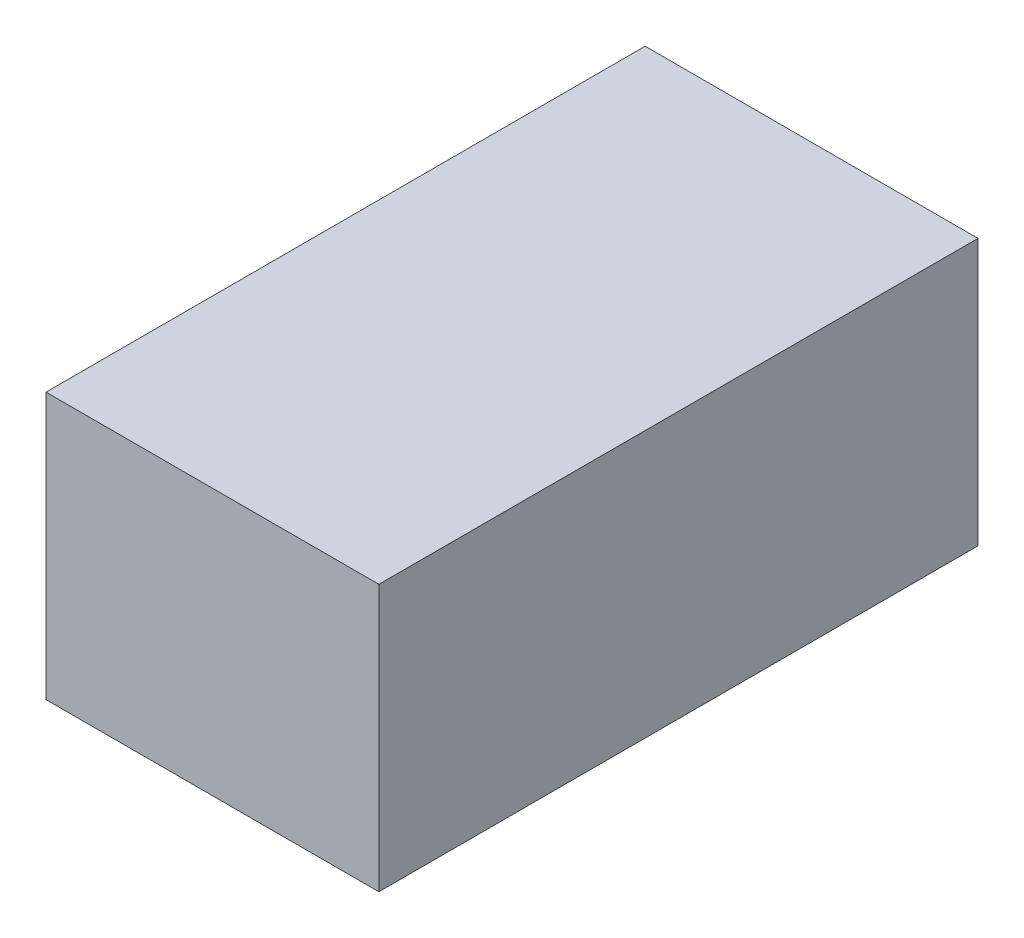
ISO-10303-21;
HEADER;
FILE_DESCRIPTION(('STEP AP214'),'2;1');
FILE_NAME('part.step','',(''),(''),'','','');
FILE_SCHEMA(('AUTOMOTIVE_DESIGN { 1 0 10303 214 1 1 1 1 }'));
ENDSEC;
DATA;
#1=APPLICATION_CONTEXT('core data for automotive mechanical design processes');
#2=APPLICATION_PROTOCOL_DEFINITION('international standard','automotive_design',2000,#1);
#3=PRODUCT_CONTEXT('',#1,'mechanical');
#4=PRODUCT('Part','Part','',(#3));
#5=PRODUCT_RELATED_PRODUCT_CATEGORY('part','',(#4));
#6=PRODUCT_DEFINITION_FORMATION('','',#4);
#7=PRODUCT_DEFINITION_CONTEXT('part definition',#1,'design');
#8=PRODUCT_DEFINITION('design','',#6,#7);
#9=PRODUCT_DEFINITION_SHAPE('','',#8);
#10=(LENGTH_UNIT() NAMED_UNIT(*) SI_UNIT(.MILLI.,.METRE.));
#11=(NAMED_UNIT(*) PLANE_ANGLE_UNIT() SI_UNIT($,.RADIAN.));
#12=(NAMED_UNIT(*) SI_UNIT($,.STERADIAN.) SOLID_ANGLE_UNIT());
#13=UNCERTAINTY_MEASURE_WITH_UNIT(LENGTH_MEASURE(1.E-05),#10,'distance_accuracy_value','');
#14=(GEOMETRIC_REPRESENTATION_CONTEXT(3) GLOBAL_UNCERTAINTY_ASSIGNED_CONTEXT((#13)) GLOBAL_UNIT_ASSIGNED_CONTEXT((#10,
#11,#12)) REPRESENTATION_CONTEXT('',''));
#15=CARTESIAN_POINT('',(0.,0.,0.));
#16=DIRECTION('',(0.,0.,1.));
#17=DIRECTION('',(1.,0.,0.));
#18=AXIS2_PLACEMENT_3D('',#15,#16,#17);
#19=CARTESIAN_POINT('',(0.,0.,54.));
#20=DIRECTION('',(1.,0.,0.));
#21=DIRECTION('',(0.,0.,-1.));
#22=AXIS2_PLACEMENT_3D('',#19,#20,#21);
#23=PLANE('',#22);
#24=DIRECTION('',(0.,-1.,0.));
#25=VECTOR('',#24,1.);
#26=CARTESIAN_POINT('',(0.,0.,0.));
#27=LINE('',#26,#25);
#28=CARTESIAN_POINT('',(0.,24.,0.));
#29=VERTEX_POINT('',#28);
#30=CARTESIAN_POINT('',(0.,0.,0.));
#31=VERTEX_POINT('',#30);
#32=EDGE_CURVE('E105',#29,#31,#27,.T.);
#33=ORIENTED_EDGE('',*,*,#32,.T.);
#34=DIRECTION('',(0.,0.,-1.));
#35=VECTOR('',#34,1.);
#36=CARTESIAN_POINT('',(0.,0.,54.));
#37=LINE('',#36,#35);
#38=CARTESIAN_POINT('',(0.,0.,54.));
#39=VERTEX_POINT('',#38);
#40=EDGE_CURVE('E11',#39,#31,#37,.T.);
#41=ORIENTED_EDGE('',*,*,#40,.F.);
#42=DIRECTION('',(0.,-1.,0.));
#43=VECTOR('',#42,1.);
#44=CARTESIAN_POINT('',(0.,0.,54.));
#45=LINE('',#44,#43);
#46=CARTESIAN_POINT('',(0.,24.,54.));
#47=VERTEX_POINT('',#46);
#48=EDGE_CURVE('E93',#47,#39,#45,.T.);
#49=ORIENTED_EDGE('',*,*,#48,.F.);
#50=DIRECTION('',(0.,0.,-1.));
#51=VECTOR('',#50,1.);
#52=CARTESIAN_POINT('',(0.,24.,54.));
#53=LINE('',#52,#51);
#54=EDGE_CURVE('E101',#47,#29,#53,.T.);
#55=ORIENTED_EDGE('',*,*,#54,.T.);
#56=EDGE_LOOP('',(#33,#41,#49,#55));
#57=FACE_BOUND('',#56,.T.);
#58=ADVANCED_FACE('F42',(#57),#23,.F.);
#59=CARTESIAN_POINT('',(0.,0.,54.));
#60=DIRECTION('',(0.,1.,0.));
#61=DIRECTION('',(0.,0.,1.));
#62=AXIS2_PLACEMENT_3D('',#59,#60,#61);
#63=PLANE('',#62);
#64=DIRECTION('',(1.,0.,0.));
#65=VECTOR('',#64,1.);
#66=CARTESIAN_POINT('',(0.,0.,0.));
#67=LINE('',#66,#65);
#68=CARTESIAN_POINT('',(30.,0.,0.));
#69=VERTEX_POINT('',#68);
#70=EDGE_CURVE('E97',#31,#69,#67,.T.);
#71=ORIENTED_EDGE('',*,*,#70,.T.);
#72=DIRECTION('',(0.,0.,-1.));
#73=VECTOR('',#72,1.);
#74=CARTESIAN_POINT('',(30.,0.,54.));
#75=LINE('',#74,#73);
#76=CARTESIAN_POINT('',(30.,0.,54.));
#77=VERTEX_POINT('',#76);
#78=EDGE_CURVE('E50',#77,#69,#75,.T.);
#79=ORIENTED_EDGE('',*,*,#78,.F.);
#80=DIRECTION('',(1.,0.,0.));
#81=VECTOR('',#80,1.);
#82=CARTESIAN_POINT('',(0.,0.,54.));
#83=LINE('',#82,#81);
#84=EDGE_CURVE('E88',#39,#77,#83,.T.);
#85=ORIENTED_EDGE('',*,*,#84,.F.);
#86=ORIENTED_EDGE('',*,*,#40,.T.);
#87=EDGE_LOOP('',(#71,#79,#85,#86));
#88=FACE_BOUND('',#87,.T.);
#89=ADVANCED_FACE('F96',(#88),#63,.F.);
#90=CARTESIAN_POINT('',(30.,0.,54.));
#91=DIRECTION('',(-1.,0.,0.));
#92=DIRECTION('',(0.,0.,1.));
#93=AXIS2_PLACEMENT_3D('',#90,#91,#92);
#94=PLANE('',#93);
#95=DIRECTION('',(0.,1.,0.));
#96=VECTOR('',#95,1.);
#97=CARTESIAN_POINT('',(30.,0.,0.));
#98=LINE('',#97,#96);
#99=CARTESIAN_POINT('',(30.,24.,0.));
#100=VERTEX_POINT('',#99);
#101=EDGE_CURVE('E75',#69,#100,#98,.T.);
#102=ORIENTED_EDGE('',*,*,#101,.T.);
#103=DIRECTION('',(0.,0.,-1.));
#104=VECTOR('',#103,1.);
#105=CARTESIAN_POINT('',(30.,24.,54.));
#106=LINE('',#105,#104);
#107=CARTESIAN_POINT('',(30.,24.,54.));
#108=VERTEX_POINT('',#107);
#109=EDGE_CURVE('E98',#108,#100,#106,.T.);
#110=ORIENTED_EDGE('',*,*,#109,.F.);
#111=DIRECTION('',(0.,1.,0.));
#112=VECTOR('',#111,1.);
#113=CARTESIAN_POINT('',(30.,0.,54.));
#114=LINE('',#113,#112);
#115=EDGE_CURVE('E91',#77,#108,#114,.T.);
#116=ORIENTED_EDGE('',*,*,#115,.F.);
#117=ORIENTED_EDGE('',*,*,#78,.T.);
#118=EDGE_LOOP('',(#102,#110,#116,#117));
#119=FACE_BOUND('',#118,.T.);
#120=ADVANCED_FACE('F99',(#119),#94,.F.);
#121=CARTESIAN_POINT('',(0.,24.,54.));
#122=DIRECTION('',(0.,-1.,0.));
#123=DIRECTION('',(0.,0.,-1.));
#124=AXIS2_PLACEMENT_3D('',#121,#122,#123);
#125=PLANE('',#124);
#126=DIRECTION('',(-1.,0.,0.));
#127=VECTOR('',#126,1.);
#128=CARTESIAN_POINT('',(0.,24.,0.));
#129=LINE('',#128,#127);
#130=EDGE_CURVE('E81',#100,#29,#129,.T.);
#131=ORIENTED_EDGE('',*,*,#130,.T.);
#132=ORIENTED_EDGE('',*,*,#54,.F.);
#133=DIRECTION('',(-1.,0.,0.));
#134=VECTOR('',#133,1.);
#135=CARTESIAN_POINT('',(0.,24.,54.));
#136=LINE('',#135,#134);
#137=EDGE_CURVE('E58',#108,#47,#136,.T.);
#138=ORIENTED_EDGE('',*,*,#137,.F.);
#139=ORIENTED_EDGE('',*,*,#109,.T.);
#140=EDGE_LOOP('',(#131,#132,#138,#139));
#141=FACE_BOUND('',#140,.T.);
#142=ADVANCED_FACE('F112',(#141),#125,.F.);
#143=CARTESIAN_POINT('',(0.,0.,54.));
#144=DIRECTION('',(0.,0.,-1.));
#145=DIRECTION('',(-1.,0.,0.));
#146=AXIS2_PLACEMENT_3D('',#143,#144,#145);
#147=PLANE('',#146);
#148=ORIENTED_EDGE('',*,*,#48,.T.);
#149=ORIENTED_EDGE('',*,*,#84,.T.);
#150=ORIENTED_EDGE('',*,*,#115,.T.);
#151=ORIENTED_EDGE('',*,*,#137,.T.);
#152=EDGE_LOOP('',(#148,#149,#150,#151));
#153=FACE_BOUND('',#152,.T.);
#154=ADVANCED_FACE('F89',(#153),#147,.F.);
#155=CARTESIAN_POINT('',(0.,0.,0.));
#156=DIRECTION('',(0.,0.,-1.));
#157=DIRECTION('',(-1.,0.,0.));
#158=AXIS2_PLACEMENT_3D('',#155,#156,#157);
#159=PLANE('',#158);
#160=ORIENTED_EDGE('',*,*,#32,.F.);
#161=ORIENTED_EDGE('',*,*,#130,.F.);
#162=ORIENTED_EDGE('',*,*,#101,.F.);
#163=ORIENTED_EDGE('',*,*,#70,.F.);
#164=EDGE_LOOP('',(#160,#161,#162,#163));
#165=FACE_BOUND('',#164,.T.);
#166=ADVANCED_FACE('F115',(#165),#159,.T.);
#167=CLOSED_SHELL('',(#58,#89,#120,#142,#154,#166));
#168=MANIFOLD_SOLID_BREP('B2',#167);
#169=ADVANCED_BREP_SHAPE_REPRESENTATION('',(#18,#168),#14);
#170=SHAPE_DEFINITION_REPRESENTATION(#9,#169);
ENDSEC;
END-ISO-10303-21;
